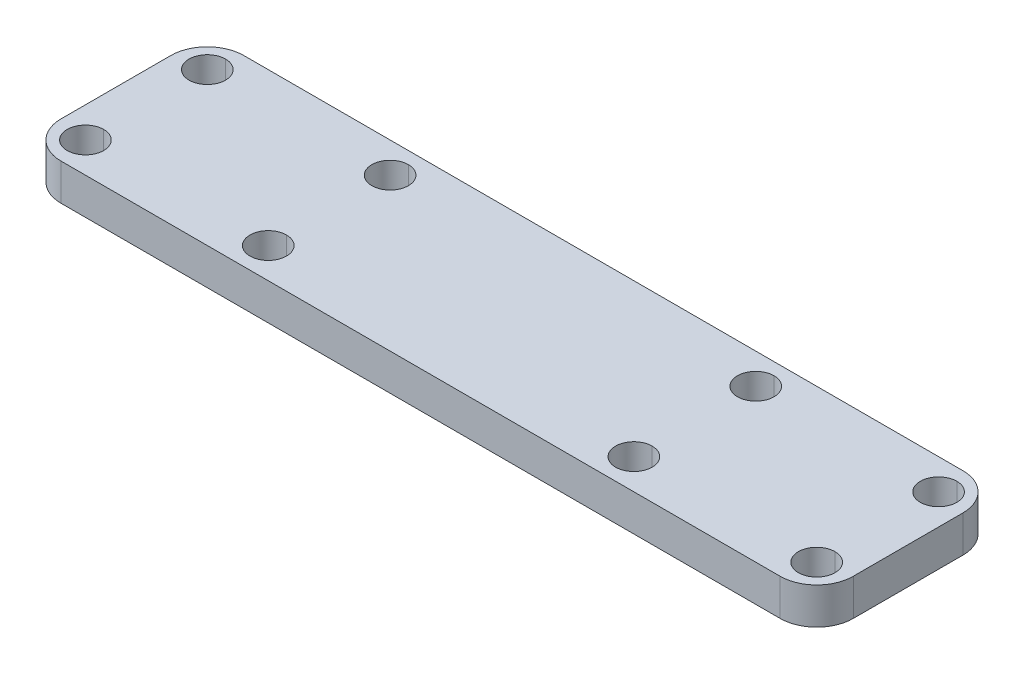
ISO-10303-21;
HEADER;
FILE_DESCRIPTION(('STEP AP214'),'2;1');
FILE_NAME('part.step','',(''),(''),'','','');
FILE_SCHEMA(('AUTOMOTIVE_DESIGN { 1 0 10303 214 1 1 1 1 }'));
ENDSEC;
DATA;
#1=APPLICATION_CONTEXT('core data for automotive mechanical design processes');
#2=APPLICATION_PROTOCOL_DEFINITION('international standard','automotive_design',2000,#1);
#3=PRODUCT_CONTEXT('',#1,'mechanical');
#4=PRODUCT('Part','Part','',(#3));
#5=PRODUCT_RELATED_PRODUCT_CATEGORY('part','',(#4));
#6=PRODUCT_DEFINITION_FORMATION('','',#4);
#7=PRODUCT_DEFINITION_CONTEXT('part definition',#1,'design');
#8=PRODUCT_DEFINITION('design','',#6,#7);
#9=PRODUCT_DEFINITION_SHAPE('','',#8);
#10=(LENGTH_UNIT() NAMED_UNIT(*) SI_UNIT(.MILLI.,.METRE.));
#11=(NAMED_UNIT(*) PLANE_ANGLE_UNIT() SI_UNIT($,.RADIAN.));
#12=(NAMED_UNIT(*) SI_UNIT($,.STERADIAN.) SOLID_ANGLE_UNIT());
#13=UNCERTAINTY_MEASURE_WITH_UNIT(LENGTH_MEASURE(1.E-05),#10,'distance_accuracy_value','');
#14=(GEOMETRIC_REPRESENTATION_CONTEXT(3) GLOBAL_UNCERTAINTY_ASSIGNED_CONTEXT((#13)) GLOBAL_UNIT_ASSIGNED_CONTEXT((#10,
#11,#12)) REPRESENTATION_CONTEXT('',''));
#15=CARTESIAN_POINT('',(0.,0.,0.));
#16=DIRECTION('',(0.,0.,1.));
#17=DIRECTION('',(1.,0.,0.));
#18=AXIS2_PLACEMENT_3D('',#15,#16,#17);
#19=CARTESIAN_POINT('',(-30.,-7.,-5.));
#20=DIRECTION('',(0.,1.,0.));
#21=DIRECTION('',(0.,0.,1.));
#22=AXIS2_PLACEMENT_3D('',#19,#20,#21);
#23=CYLINDRICAL_SURFACE('',#22,1.5);
#24=DIRECTION('',(0.,1.,0.));
#25=VECTOR('',#24,1.);
#26=CARTESIAN_POINT('',(-30.,-7.,-6.5));
#27=LINE('',#26,#25);
#28=CARTESIAN_POINT('',(-30.,0.,-6.5));
#29=VERTEX_POINT('',#28);
#30=CARTESIAN_POINT('',(-30.,3.,-6.5));
#31=VERTEX_POINT('',#30);
#32=EDGE_CURVE('E578',#29,#31,#27,.T.);
#33=ORIENTED_EDGE('',*,*,#32,.F.);
#34=CARTESIAN_POINT('',(-30.,0.,-5.));
#35=DIRECTION('',(0.,1.,0.));
#36=DIRECTION('',(0.,0.,1.));
#37=AXIS2_PLACEMENT_3D('',#34,#35,#36);
#38=CIRCLE('',#37,1.5);
#39=CARTESIAN_POINT('',(-30.,0.,-3.5));
#40=VERTEX_POINT('',#39);
#41=EDGE_CURVE('E428',#40,#29,#38,.T.);
#42=ORIENTED_EDGE('',*,*,#41,.F.);
#43=DIRECTION('',(0.,1.,0.));
#44=VECTOR('',#43,1.);
#45=CARTESIAN_POINT('',(-30.,-7.,-3.5));
#46=LINE('',#45,#44);
#47=CARTESIAN_POINT('',(-30.,3.,-3.5));
#48=VERTEX_POINT('',#47);
#49=EDGE_CURVE('E263',#40,#48,#46,.T.);
#50=ORIENTED_EDGE('',*,*,#49,.T.);
#51=CARTESIAN_POINT('',(-30.,3.,-5.));
#52=DIRECTION('',(0.,1.,0.));
#53=DIRECTION('',(0.,0.,1.));
#54=AXIS2_PLACEMENT_3D('',#51,#52,#53);
#55=CIRCLE('',#54,1.5);
#56=EDGE_CURVE('E246',#48,#31,#55,.T.);
#57=ORIENTED_EDGE('',*,*,#56,.T.);
#58=EDGE_LOOP('',(#33,#42,#50,#57));
#59=FACE_BOUND('',#58,.T.);
#60=ADVANCED_FACE('F16',(#59),#23,.F.);
#61=CARTESIAN_POINT('',(-15.,-7.,-5.));
#62=DIRECTION('',(0.,1.,0.));
#63=DIRECTION('',(0.,0.,1.));
#64=AXIS2_PLACEMENT_3D('',#61,#62,#63);
#65=CYLINDRICAL_SURFACE('',#64,1.5);
#66=DIRECTION('',(0.,1.,0.));
#67=VECTOR('',#66,1.);
#68=CARTESIAN_POINT('',(-15.,-7.,-6.5));
#69=LINE('',#68,#67);
#70=CARTESIAN_POINT('',(-15.,0.,-6.5));
#71=VERTEX_POINT('',#70);
#72=CARTESIAN_POINT('',(-15.,3.,-6.5));
#73=VERTEX_POINT('',#72);
#74=EDGE_CURVE('E238',#71,#73,#69,.T.);
#75=ORIENTED_EDGE('',*,*,#74,.F.);
#76=CARTESIAN_POINT('',(-15.,0.,-5.));
#77=DIRECTION('',(0.,1.,0.));
#78=DIRECTION('',(0.,0.,1.));
#79=AXIS2_PLACEMENT_3D('',#76,#77,#78);
#80=CIRCLE('',#79,1.5);
#81=CARTESIAN_POINT('',(-15.,0.,-3.5));
#82=VERTEX_POINT('',#81);
#83=EDGE_CURVE('E396',#82,#71,#80,.T.);
#84=ORIENTED_EDGE('',*,*,#83,.F.);
#85=DIRECTION('',(0.,1.,0.));
#86=VECTOR('',#85,1.);
#87=CARTESIAN_POINT('',(-15.,-7.,-3.5));
#88=LINE('',#87,#86);
#89=CARTESIAN_POINT('',(-15.,3.,-3.5));
#90=VERTEX_POINT('',#89);
#91=EDGE_CURVE('E241',#82,#90,#88,.T.);
#92=ORIENTED_EDGE('',*,*,#91,.T.);
#93=CARTESIAN_POINT('',(-15.,3.,-5.));
#94=DIRECTION('',(0.,1.,0.));
#95=DIRECTION('',(0.,0.,1.));
#96=AXIS2_PLACEMENT_3D('',#93,#94,#95);
#97=CIRCLE('',#96,1.5);
#98=EDGE_CURVE('E234',#90,#73,#97,.T.);
#99=ORIENTED_EDGE('',*,*,#98,.T.);
#100=EDGE_LOOP('',(#75,#84,#92,#99));
#101=FACE_BOUND('',#100,.T.);
#102=ADVANCED_FACE('F236',(#101),#65,.F.);
#103=CARTESIAN_POINT('',(15.,-7.,-5.));
#104=DIRECTION('',(0.,1.,0.));
#105=DIRECTION('',(0.,0.,1.));
#106=AXIS2_PLACEMENT_3D('',#103,#104,#105);
#107=CYLINDRICAL_SURFACE('',#106,1.5);
#108=DIRECTION('',(0.,1.,0.));
#109=VECTOR('',#108,1.);
#110=CARTESIAN_POINT('',(15.,-7.,-6.5));
#111=LINE('',#110,#109);
#112=CARTESIAN_POINT('',(15.,0.,-6.5));
#113=VERTEX_POINT('',#112);
#114=CARTESIAN_POINT('',(15.,3.,-6.5));
#115=VERTEX_POINT('',#114);
#116=EDGE_CURVE('E285',#113,#115,#111,.T.);
#117=ORIENTED_EDGE('',*,*,#116,.F.);
#118=CARTESIAN_POINT('',(15.,0.,-5.));
#119=DIRECTION('',(0.,1.,0.));
#120=DIRECTION('',(0.,0.,1.));
#121=AXIS2_PLACEMENT_3D('',#118,#119,#120);
#122=CIRCLE('',#121,1.5);
#123=CARTESIAN_POINT('',(15.,0.,-3.5));
#124=VERTEX_POINT('',#123);
#125=EDGE_CURVE('E392',#124,#113,#122,.T.);
#126=ORIENTED_EDGE('',*,*,#125,.F.);
#127=DIRECTION('',(0.,1.,0.));
#128=VECTOR('',#127,1.);
#129=CARTESIAN_POINT('',(15.,-7.,-3.5));
#130=LINE('',#129,#128);
#131=CARTESIAN_POINT('',(15.,3.,-3.5));
#132=VERTEX_POINT('',#131);
#133=EDGE_CURVE('E295',#124,#132,#130,.T.);
#134=ORIENTED_EDGE('',*,*,#133,.T.);
#135=CARTESIAN_POINT('',(15.,3.,-5.));
#136=DIRECTION('',(0.,1.,0.));
#137=DIRECTION('',(0.,0.,1.));
#138=AXIS2_PLACEMENT_3D('',#135,#136,#137);
#139=CIRCLE('',#138,1.5);
#140=EDGE_CURVE('E245',#132,#115,#139,.T.);
#141=ORIENTED_EDGE('',*,*,#140,.T.);
#142=EDGE_LOOP('',(#117,#126,#134,#141));
#143=FACE_BOUND('',#142,.T.);
#144=ADVANCED_FACE('F507',(#143),#107,.F.);
#145=CARTESIAN_POINT('',(30.,-7.,-5.));
#146=DIRECTION('',(0.,1.,0.));
#147=DIRECTION('',(0.,0.,1.));
#148=AXIS2_PLACEMENT_3D('',#145,#146,#147);
#149=CYLINDRICAL_SURFACE('',#148,1.5);
#150=DIRECTION('',(0.,1.,0.));
#151=VECTOR('',#150,1.);
#152=CARTESIAN_POINT('',(30.,-7.,-6.5));
#153=LINE('',#152,#151);
#154=CARTESIAN_POINT('',(30.,0.,-6.5));
#155=VERTEX_POINT('',#154);
#156=CARTESIAN_POINT('',(30.,3.,-6.5));
#157=VERTEX_POINT('',#156);
#158=EDGE_CURVE('E300',#155,#157,#153,.T.);
#159=ORIENTED_EDGE('',*,*,#158,.F.);
#160=CARTESIAN_POINT('',(30.,0.,-5.));
#161=DIRECTION('',(0.,1.,0.));
#162=DIRECTION('',(0.,0.,1.));
#163=AXIS2_PLACEMENT_3D('',#160,#161,#162);
#164=CIRCLE('',#163,1.5);
#165=CARTESIAN_POINT('',(30.,0.,-3.5));
#166=VERTEX_POINT('',#165);
#167=EDGE_CURVE('E395',#166,#155,#164,.T.);
#168=ORIENTED_EDGE('',*,*,#167,.F.);
#169=DIRECTION('',(0.,1.,0.));
#170=VECTOR('',#169,1.);
#171=CARTESIAN_POINT('',(30.,-7.,-3.5));
#172=LINE('',#171,#170);
#173=CARTESIAN_POINT('',(30.,3.,-3.5));
#174=VERTEX_POINT('',#173);
#175=EDGE_CURVE('E269',#166,#174,#172,.T.);
#176=ORIENTED_EDGE('',*,*,#175,.T.);
#177=CARTESIAN_POINT('',(30.,3.,-5.));
#178=DIRECTION('',(0.,1.,0.));
#179=DIRECTION('',(0.,0.,1.));
#180=AXIS2_PLACEMENT_3D('',#177,#178,#179);
#181=CIRCLE('',#180,1.5);
#182=EDGE_CURVE('E448',#174,#157,#181,.T.);
#183=ORIENTED_EDGE('',*,*,#182,.T.);
#184=EDGE_LOOP('',(#159,#168,#176,#183));
#185=FACE_BOUND('',#184,.T.);
#186=ADVANCED_FACE('F607',(#185),#149,.F.);
#187=CARTESIAN_POINT('',(-29.5,3.,-4.5));
#188=DIRECTION('',(0.,-1.,0.));
#189=DIRECTION('',(0.,0.,-1.));
#190=AXIS2_PLACEMENT_3D('',#187,#188,#189);
#191=CYLINDRICAL_SURFACE('',#190,3.);
#192=CARTESIAN_POINT('',(-29.5,3.,-4.5));
#193=DIRECTION('',(0.,1.,0.));
#194=DIRECTION('',(0.,0.,1.));
#195=AXIS2_PLACEMENT_3D('',#192,#193,#194);
#196=CIRCLE('',#195,3.);
#197=CARTESIAN_POINT('',(-29.5,3.,-7.5));
#198=VERTEX_POINT('',#197);
#199=CARTESIAN_POINT('',(-32.5,3.,-4.5));
#200=VERTEX_POINT('',#199);
#201=EDGE_CURVE('E441',#198,#200,#196,.T.);
#202=ORIENTED_EDGE('',*,*,#201,.F.);
#203=DIRECTION('',(0.,1.,0.));
#204=VECTOR('',#203,1.);
#205=CARTESIAN_POINT('',(-29.5,3.,-7.5));
#206=LINE('',#205,#204);
#207=CARTESIAN_POINT('',(-29.5,0.,-7.5));
#208=VERTEX_POINT('',#207);
#209=EDGE_CURVE('E342',#208,#198,#206,.T.);
#210=ORIENTED_EDGE('',*,*,#209,.F.);
#211=CARTESIAN_POINT('',(-29.5,0.,-4.5));
#212=DIRECTION('',(0.,-1.,0.));
#213=DIRECTION('',(0.,0.,1.));
#214=AXIS2_PLACEMENT_3D('',#211,#212,#213);
#215=CIRCLE('',#214,3.);
#216=CARTESIAN_POINT('',(-32.5,0.,-4.5));
#217=VERTEX_POINT('',#216);
#218=EDGE_CURVE('E462',#217,#208,#215,.T.);
#219=ORIENTED_EDGE('',*,*,#218,.F.);
#220=DIRECTION('',(0.,-1.,0.));
#221=VECTOR('',#220,1.);
#222=CARTESIAN_POINT('',(-32.5,3.,-4.5));
#223=LINE('',#222,#221);
#224=EDGE_CURVE('E266',#200,#217,#223,.T.);
#225=ORIENTED_EDGE('',*,*,#224,.F.);
#226=EDGE_LOOP('',(#202,#210,#219,#225));
#227=FACE_BOUND('',#226,.T.);
#228=ADVANCED_FACE('F605',(#227),#191,.T.);
#229=CARTESIAN_POINT('',(-29.5,3.,4.5));
#230=DIRECTION('',(0.,-1.,0.));
#231=DIRECTION('',(0.,0.,-1.));
#232=AXIS2_PLACEMENT_3D('',#229,#230,#231);
#233=CYLINDRICAL_SURFACE('',#232,3.);
#234=CARTESIAN_POINT('',(-29.5,3.,4.5));
#235=DIRECTION('',(0.,1.,0.));
#236=DIRECTION('',(0.,0.,1.));
#237=AXIS2_PLACEMENT_3D('',#234,#235,#236);
#238=CIRCLE('',#237,3.);
#239=CARTESIAN_POINT('',(-32.5,3.,4.5));
#240=VERTEX_POINT('',#239);
#241=CARTESIAN_POINT('',(-29.5,3.,7.5));
#242=VERTEX_POINT('',#241);
#243=EDGE_CURVE('E37',#240,#242,#238,.T.);
#244=ORIENTED_EDGE('',*,*,#243,.F.);
#245=DIRECTION('',(0.,1.,0.));
#246=VECTOR('',#245,1.);
#247=CARTESIAN_POINT('',(-32.5,3.,4.5));
#248=LINE('',#247,#246);
#249=CARTESIAN_POINT('',(-32.5,0.,4.5));
#250=VERTEX_POINT('',#249);
#251=EDGE_CURVE('E341',#250,#240,#248,.T.);
#252=ORIENTED_EDGE('',*,*,#251,.F.);
#253=CARTESIAN_POINT('',(-29.5,0.,4.5));
#254=DIRECTION('',(0.,-1.,0.));
#255=DIRECTION('',(0.,0.,1.));
#256=AXIS2_PLACEMENT_3D('',#253,#254,#255);
#257=CIRCLE('',#256,3.);
#258=CARTESIAN_POINT('',(-29.5,0.,7.5));
#259=VERTEX_POINT('',#258);
#260=EDGE_CURVE('E459',#259,#250,#257,.T.);
#261=ORIENTED_EDGE('',*,*,#260,.F.);
#262=DIRECTION('',(0.,-1.,0.));
#263=VECTOR('',#262,1.);
#264=CARTESIAN_POINT('',(-29.5,3.,7.5));
#265=LINE('',#264,#263);
#266=EDGE_CURVE('E434',#242,#259,#265,.T.);
#267=ORIENTED_EDGE('',*,*,#266,.F.);
#268=EDGE_LOOP('',(#244,#252,#261,#267));
#269=FACE_BOUND('',#268,.T.);
#270=ADVANCED_FACE('F543',(#269),#233,.T.);
#271=CARTESIAN_POINT('',(29.5,3.,4.5));
#272=DIRECTION('',(0.,-1.,0.));
#273=DIRECTION('',(0.,0.,-1.));
#274=AXIS2_PLACEMENT_3D('',#271,#272,#273);
#275=CYLINDRICAL_SURFACE('',#274,3.);
#276=CARTESIAN_POINT('',(29.5,3.,4.5));
#277=DIRECTION('',(0.,1.,0.));
#278=DIRECTION('',(0.,0.,1.));
#279=AXIS2_PLACEMENT_3D('',#276,#277,#278);
#280=CIRCLE('',#279,3.);
#281=CARTESIAN_POINT('',(29.5,3.,7.5));
#282=VERTEX_POINT('',#281);
#283=CARTESIAN_POINT('',(32.5,3.,4.5));
#284=VERTEX_POINT('',#283);
#285=EDGE_CURVE('E48',#282,#284,#280,.T.);
#286=ORIENTED_EDGE('',*,*,#285,.F.);
#287=DIRECTION('',(0.,1.,0.));
#288=VECTOR('',#287,1.);
#289=CARTESIAN_POINT('',(29.5,3.,7.5));
#290=LINE('',#289,#288);
#291=CARTESIAN_POINT('',(29.5,0.,7.5));
#292=VERTEX_POINT('',#291);
#293=EDGE_CURVE('E418',#292,#282,#290,.T.);
#294=ORIENTED_EDGE('',*,*,#293,.F.);
#295=CARTESIAN_POINT('',(29.5,0.,4.5));
#296=DIRECTION('',(0.,-1.,0.));
#297=DIRECTION('',(0.,0.,1.));
#298=AXIS2_PLACEMENT_3D('',#295,#296,#297);
#299=CIRCLE('',#298,3.);
#300=CARTESIAN_POINT('',(32.5,0.,4.5));
#301=VERTEX_POINT('',#300);
#302=EDGE_CURVE('E463',#301,#292,#299,.T.);
#303=ORIENTED_EDGE('',*,*,#302,.F.);
#304=DIRECTION('',(0.,-1.,0.));
#305=VECTOR('',#304,1.);
#306=CARTESIAN_POINT('',(32.5,3.,4.5));
#307=LINE('',#306,#305);
#308=EDGE_CURVE('E307',#284,#301,#307,.T.);
#309=ORIENTED_EDGE('',*,*,#308,.F.);
#310=EDGE_LOOP('',(#286,#294,#303,#309));
#311=FACE_BOUND('',#310,.T.);
#312=ADVANCED_FACE('F539',(#311),#275,.T.);
#313=CARTESIAN_POINT('',(29.5,3.,-4.5));
#314=DIRECTION('',(0.,-1.,0.));
#315=DIRECTION('',(0.,0.,-1.));
#316=AXIS2_PLACEMENT_3D('',#313,#314,#315);
#317=CYLINDRICAL_SURFACE('',#316,3.);
#318=CARTESIAN_POINT('',(29.5,3.,-4.5));
#319=DIRECTION('',(0.,1.,0.));
#320=DIRECTION('',(0.,0.,1.));
#321=AXIS2_PLACEMENT_3D('',#318,#319,#320);
#322=CIRCLE('',#321,3.);
#323=CARTESIAN_POINT('',(32.5,3.,-4.5));
#324=VERTEX_POINT('',#323);
#325=CARTESIAN_POINT('',(29.5,3.,-7.5));
#326=VERTEX_POINT('',#325);
#327=EDGE_CURVE('E438',#324,#326,#322,.T.);
#328=ORIENTED_EDGE('',*,*,#327,.F.);
#329=DIRECTION('',(0.,1.,0.));
#330=VECTOR('',#329,1.);
#331=CARTESIAN_POINT('',(32.5,3.,-4.5));
#332=LINE('',#331,#330);
#333=CARTESIAN_POINT('',(32.5,0.,-4.5));
#334=VERTEX_POINT('',#333);
#335=EDGE_CURVE('E388',#334,#324,#332,.T.);
#336=ORIENTED_EDGE('',*,*,#335,.F.);
#337=CARTESIAN_POINT('',(29.5,0.,-4.5));
#338=DIRECTION('',(0.,-1.,0.));
#339=DIRECTION('',(0.,0.,1.));
#340=AXIS2_PLACEMENT_3D('',#337,#338,#339);
#341=CIRCLE('',#340,3.);
#342=CARTESIAN_POINT('',(29.5,0.,-7.5));
#343=VERTEX_POINT('',#342);
#344=EDGE_CURVE('E466',#343,#334,#341,.T.);
#345=ORIENTED_EDGE('',*,*,#344,.F.);
#346=DIRECTION('',(0.,-1.,0.));
#347=VECTOR('',#346,1.);
#348=CARTESIAN_POINT('',(29.5,3.,-7.5));
#349=LINE('',#348,#347);
#350=EDGE_CURVE('E403',#326,#343,#349,.T.);
#351=ORIENTED_EDGE('',*,*,#350,.F.);
#352=EDGE_LOOP('',(#328,#336,#345,#351));
#353=FACE_BOUND('',#352,.T.);
#354=ADVANCED_FACE('F532',(#353),#317,.T.);
#355=CARTESIAN_POINT('',(-30.,-7.,5.));
#356=DIRECTION('',(0.,1.,0.));
#357=DIRECTION('',(0.,0.,1.));
#358=AXIS2_PLACEMENT_3D('',#355,#356,#357);
#359=CYLINDRICAL_SURFACE('',#358,1.5);
#360=DIRECTION('',(0.,1.,0.));
#361=VECTOR('',#360,1.);
#362=CARTESIAN_POINT('',(-30.,-7.,3.5));
#363=LINE('',#362,#361);
#364=CARTESIAN_POINT('',(-30.,0.,3.5));
#365=VERTEX_POINT('',#364);
#366=CARTESIAN_POINT('',(-30.,3.,3.5));
#367=VERTEX_POINT('',#366);
#368=EDGE_CURVE('E316',#365,#367,#363,.T.);
#369=ORIENTED_EDGE('',*,*,#368,.F.);
#370=CARTESIAN_POINT('',(-30.,0.,5.));
#371=DIRECTION('',(0.,1.,0.));
#372=DIRECTION('',(0.,0.,1.));
#373=AXIS2_PLACEMENT_3D('',#370,#371,#372);
#374=CIRCLE('',#373,1.5);
#375=CARTESIAN_POINT('',(-30.,0.,6.5));
#376=VERTEX_POINT('',#375);
#377=EDGE_CURVE('E278',#376,#365,#374,.T.);
#378=ORIENTED_EDGE('',*,*,#377,.F.);
#379=DIRECTION('',(0.,1.,0.));
#380=VECTOR('',#379,1.);
#381=CARTESIAN_POINT('',(-30.,-7.,6.5));
#382=LINE('',#381,#380);
#383=CARTESIAN_POINT('',(-30.,3.,6.5));
#384=VERTEX_POINT('',#383);
#385=EDGE_CURVE('E321',#376,#384,#382,.T.);
#386=ORIENTED_EDGE('',*,*,#385,.T.);
#387=CARTESIAN_POINT('',(-30.,3.,5.));
#388=DIRECTION('',(0.,1.,0.));
#389=DIRECTION('',(0.,0.,1.));
#390=AXIS2_PLACEMENT_3D('',#387,#388,#389);
#391=CIRCLE('',#390,1.5);
#392=EDGE_CURVE('E451',#384,#367,#391,.T.);
#393=ORIENTED_EDGE('',*,*,#392,.T.);
#394=EDGE_LOOP('',(#369,#378,#386,#393));
#395=FACE_BOUND('',#394,.T.);
#396=ADVANCED_FACE('F669',(#395),#359,.F.);
#397=CARTESIAN_POINT('',(-15.,-7.,5.));
#398=DIRECTION('',(0.,1.,0.));
#399=DIRECTION('',(0.,0.,1.));
#400=AXIS2_PLACEMENT_3D('',#397,#398,#399);
#401=CYLINDRICAL_SURFACE('',#400,1.5);
#402=DIRECTION('',(0.,1.,0.));
#403=VECTOR('',#402,1.);
#404=CARTESIAN_POINT('',(-15.,-7.,3.5));
#405=LINE('',#404,#403);
#406=CARTESIAN_POINT('',(-15.,0.,3.5));
#407=VERTEX_POINT('',#406);
#408=CARTESIAN_POINT('',(-15.,3.,3.5));
#409=VERTEX_POINT('',#408);
#410=EDGE_CURVE('E332',#407,#409,#405,.T.);
#411=ORIENTED_EDGE('',*,*,#410,.F.);
#412=CARTESIAN_POINT('',(-15.,0.,5.));
#413=DIRECTION('',(0.,1.,0.));
#414=DIRECTION('',(0.,0.,1.));
#415=AXIS2_PLACEMENT_3D('',#412,#413,#414);
#416=CIRCLE('',#415,1.5);
#417=CARTESIAN_POINT('',(-15.,0.,6.5));
#418=VERTEX_POINT('',#417);
#419=EDGE_CURVE('E275',#418,#407,#416,.T.);
#420=ORIENTED_EDGE('',*,*,#419,.F.);
#421=DIRECTION('',(0.,1.,0.));
#422=VECTOR('',#421,1.);
#423=CARTESIAN_POINT('',(-15.,-7.,6.5));
#424=LINE('',#423,#422);
#425=CARTESIAN_POINT('',(-15.,3.,6.5));
#426=VERTEX_POINT('',#425);
#427=EDGE_CURVE('E343',#418,#426,#424,.T.);
#428=ORIENTED_EDGE('',*,*,#427,.T.);
#429=CARTESIAN_POINT('',(-15.,3.,5.));
#430=DIRECTION('',(0.,1.,0.));
#431=DIRECTION('',(0.,0.,1.));
#432=AXIS2_PLACEMENT_3D('',#429,#430,#431);
#433=CIRCLE('',#432,1.5);
#434=EDGE_CURVE('E452',#426,#409,#433,.T.);
#435=ORIENTED_EDGE('',*,*,#434,.T.);
#436=EDGE_LOOP('',(#411,#420,#428,#435));
#437=FACE_BOUND('',#436,.T.);
#438=ADVANCED_FACE('F679',(#437),#401,.F.);
#439=CARTESIAN_POINT('',(15.,-7.,5.));
#440=DIRECTION('',(0.,1.,0.));
#441=DIRECTION('',(0.,0.,1.));
#442=AXIS2_PLACEMENT_3D('',#439,#440,#441);
#443=CYLINDRICAL_SURFACE('',#442,1.5);
#444=DIRECTION('',(0.,1.,0.));
#445=VECTOR('',#444,1.);
#446=CARTESIAN_POINT('',(15.,-7.,3.5));
#447=LINE('',#446,#445);
#448=CARTESIAN_POINT('',(15.,0.,3.5));
#449=VERTEX_POINT('',#448);
#450=CARTESIAN_POINT('',(15.,3.,3.5));
#451=VERTEX_POINT('',#450);
#452=EDGE_CURVE('E356',#449,#451,#447,.T.);
#453=ORIENTED_EDGE('',*,*,#452,.F.);
#454=CARTESIAN_POINT('',(15.,0.,5.));
#455=DIRECTION('',(0.,1.,0.));
#456=DIRECTION('',(0.,0.,1.));
#457=AXIS2_PLACEMENT_3D('',#454,#455,#456);
#458=CIRCLE('',#457,1.5);
#459=CARTESIAN_POINT('',(15.,0.,6.5));
#460=VERTEX_POINT('',#459);
#461=EDGE_CURVE('E24',#460,#449,#458,.T.);
#462=ORIENTED_EDGE('',*,*,#461,.F.);
#463=DIRECTION('',(0.,1.,0.));
#464=VECTOR('',#463,1.);
#465=CARTESIAN_POINT('',(15.,-7.,6.5));
#466=LINE('',#465,#464);
#467=CARTESIAN_POINT('',(15.,3.,6.5));
#468=VERTEX_POINT('',#467);
#469=EDGE_CURVE('E364',#460,#468,#466,.T.);
#470=ORIENTED_EDGE('',*,*,#469,.T.);
#471=CARTESIAN_POINT('',(15.,3.,5.));
#472=DIRECTION('',(0.,1.,0.));
#473=DIRECTION('',(0.,0.,1.));
#474=AXIS2_PLACEMENT_3D('',#471,#472,#473);
#475=CIRCLE('',#474,1.5);
#476=EDGE_CURVE('E455',#468,#451,#475,.T.);
#477=ORIENTED_EDGE('',*,*,#476,.T.);
#478=EDGE_LOOP('',(#453,#462,#470,#477));
#479=FACE_BOUND('',#478,.T.);
#480=ADVANCED_FACE('F486',(#479),#443,.F.);
#481=CARTESIAN_POINT('',(30.,-7.,5.));
#482=DIRECTION('',(0.,1.,0.));
#483=DIRECTION('',(0.,0.,1.));
#484=AXIS2_PLACEMENT_3D('',#481,#482,#483);
#485=CYLINDRICAL_SURFACE('',#484,1.5);
#486=DIRECTION('',(0.,1.,0.));
#487=VECTOR('',#486,1.);
#488=CARTESIAN_POINT('',(30.,-7.,3.5));
#489=LINE('',#488,#487);
#490=CARTESIAN_POINT('',(30.,0.,3.5));
#491=VERTEX_POINT('',#490);
#492=CARTESIAN_POINT('',(30.,3.,3.5));
#493=VERTEX_POINT('',#492);
#494=EDGE_CURVE('E372',#491,#493,#489,.T.);
#495=ORIENTED_EDGE('',*,*,#494,.F.);
#496=CARTESIAN_POINT('',(30.,0.,5.));
#497=DIRECTION('',(0.,1.,0.));
#498=DIRECTION('',(0.,0.,1.));
#499=AXIS2_PLACEMENT_3D('',#496,#497,#498);
#500=CIRCLE('',#499,1.5);
#501=CARTESIAN_POINT('',(30.,0.,6.5));
#502=VERTEX_POINT('',#501);
#503=EDGE_CURVE('E10',#502,#491,#500,.T.);
#504=ORIENTED_EDGE('',*,*,#503,.F.);
#505=DIRECTION('',(0.,1.,0.));
#506=VECTOR('',#505,1.);
#507=CARTESIAN_POINT('',(30.,-7.,6.5));
#508=LINE('',#507,#506);
#509=CARTESIAN_POINT('',(30.,3.,6.5));
#510=VERTEX_POINT('',#509);
#511=EDGE_CURVE('E380',#502,#510,#508,.T.);
#512=ORIENTED_EDGE('',*,*,#511,.T.);
#513=CARTESIAN_POINT('',(30.,3.,5.));
#514=DIRECTION('',(0.,1.,0.));
#515=DIRECTION('',(0.,0.,1.));
#516=AXIS2_PLACEMENT_3D('',#513,#514,#515);
#517=CIRCLE('',#516,1.5);
#518=EDGE_CURVE('E458',#510,#493,#517,.T.);
#519=ORIENTED_EDGE('',*,*,#518,.T.);
#520=EDGE_LOOP('',(#495,#504,#512,#519));
#521=FACE_BOUND('',#520,.T.);
#522=ADVANCED_FACE('F515',(#521),#485,.F.);
#523=CARTESIAN_POINT('',(0.,0.,0.));
#524=DIRECTION('',(0.,1.,0.));
#525=DIRECTION('',(1.,0.,0.));
#526=AXIS2_PLACEMENT_3D('',#523,#524,#525);
#527=PLANE('',#526);
#528=ORIENTED_EDGE('',*,*,#503,.T.);
#529=CARTESIAN_POINT('',(30.,0.,5.));
#530=DIRECTION('',(0.,1.,0.));
#531=DIRECTION('',(0.,0.,1.));
#532=AXIS2_PLACEMENT_3D('',#529,#530,#531);
#533=CIRCLE('',#532,1.5);
#534=EDGE_CURVE('E368',#491,#502,#533,.T.);
#535=ORIENTED_EDGE('',*,*,#534,.T.);
#536=EDGE_LOOP('',(#528,#535));
#537=FACE_BOUND('',#536,.T.);
#538=ORIENTED_EDGE('',*,*,#461,.T.);
#539=CARTESIAN_POINT('',(15.,0.,5.));
#540=DIRECTION('',(0.,1.,0.));
#541=DIRECTION('',(0.,0.,1.));
#542=AXIS2_PLACEMENT_3D('',#539,#540,#541);
#543=CIRCLE('',#542,1.5);
#544=EDGE_CURVE('E347',#449,#460,#543,.T.);
#545=ORIENTED_EDGE('',*,*,#544,.T.);
#546=EDGE_LOOP('',(#538,#545));
#547=FACE_BOUND('',#546,.T.);
#548=ORIENTED_EDGE('',*,*,#419,.T.);
#549=CARTESIAN_POINT('',(-15.,0.,5.));
#550=DIRECTION('',(0.,1.,0.));
#551=DIRECTION('',(0.,0.,1.));
#552=AXIS2_PLACEMENT_3D('',#549,#550,#551);
#553=CIRCLE('',#552,1.5);
#554=EDGE_CURVE('E325',#407,#418,#553,.T.);
#555=ORIENTED_EDGE('',*,*,#554,.T.);
#556=EDGE_LOOP('',(#548,#555));
#557=FACE_BOUND('',#556,.T.);
#558=ORIENTED_EDGE('',*,*,#377,.T.);
#559=CARTESIAN_POINT('',(-30.,0.,5.));
#560=DIRECTION('',(0.,1.,0.));
#561=DIRECTION('',(0.,0.,1.));
#562=AXIS2_PLACEMENT_3D('',#559,#560,#561);
#563=CIRCLE('',#562,1.5);
#564=EDGE_CURVE('E273',#365,#376,#563,.T.);
#565=ORIENTED_EDGE('',*,*,#564,.T.);
#566=EDGE_LOOP('',(#558,#565));
#567=FACE_BOUND('',#566,.T.);
#568=ORIENTED_EDGE('',*,*,#167,.T.);
#569=CARTESIAN_POINT('',(30.,0.,-5.));
#570=DIRECTION('',(0.,1.,0.));
#571=DIRECTION('',(0.,0.,1.));
#572=AXIS2_PLACEMENT_3D('',#569,#570,#571);
#573=CIRCLE('',#572,1.5);
#574=EDGE_CURVE('E296',#155,#166,#573,.T.);
#575=ORIENTED_EDGE('',*,*,#574,.T.);
#576=EDGE_LOOP('',(#568,#575));
#577=FACE_BOUND('',#576,.T.);
#578=ORIENTED_EDGE('',*,*,#125,.T.);
#579=CARTESIAN_POINT('',(15.,0.,-5.));
#580=DIRECTION('',(0.,1.,0.));
#581=DIRECTION('',(0.,0.,1.));
#582=AXIS2_PLACEMENT_3D('',#579,#580,#581);
#583=CIRCLE('',#582,1.5);
#584=EDGE_CURVE('E281',#113,#124,#583,.T.);
#585=ORIENTED_EDGE('',*,*,#584,.T.);
#586=EDGE_LOOP('',(#578,#585));
#587=FACE_BOUND('',#586,.T.);
#588=ORIENTED_EDGE('',*,*,#83,.T.);
#589=CARTESIAN_POINT('',(-15.,0.,-5.));
#590=DIRECTION('',(0.,1.,0.));
#591=DIRECTION('',(0.,0.,1.));
#592=AXIS2_PLACEMENT_3D('',#589,#590,#591);
#593=CIRCLE('',#592,1.5);
#594=EDGE_CURVE('E256',#71,#82,#593,.T.);
#595=ORIENTED_EDGE('',*,*,#594,.T.);
#596=EDGE_LOOP('',(#588,#595));
#597=FACE_BOUND('',#596,.T.);
#598=ORIENTED_EDGE('',*,*,#41,.T.);
#599=CARTESIAN_POINT('',(-30.,0.,-5.));
#600=DIRECTION('',(0.,1.,0.));
#601=DIRECTION('',(0.,0.,1.));
#602=AXIS2_PLACEMENT_3D('',#599,#600,#601);
#603=CIRCLE('',#602,1.5);
#604=EDGE_CURVE('E590',#29,#40,#603,.T.);
#605=ORIENTED_EDGE('',*,*,#604,.T.);
#606=EDGE_LOOP('',(#598,#605));
#607=FACE_BOUND('',#606,.T.);
#608=DIRECTION('',(-1.,0.,0.));
#609=VECTOR('',#608,1.);
#610=CARTESIAN_POINT('',(-32.5,0.,-7.5));
#611=LINE('',#610,#609);
#612=EDGE_CURVE('E407',#343,#208,#611,.T.);
#613=ORIENTED_EDGE('',*,*,#612,.F.);
#614=ORIENTED_EDGE('',*,*,#344,.T.);
#615=DIRECTION('',(0.,0.,-1.));
#616=VECTOR('',#615,1.);
#617=CARTESIAN_POINT('',(32.5,0.,-7.5));
#618=LINE('',#617,#616);
#619=EDGE_CURVE('E384',#301,#334,#618,.T.);
#620=ORIENTED_EDGE('',*,*,#619,.F.);
#621=ORIENTED_EDGE('',*,*,#302,.T.);
#622=DIRECTION('',(1.,0.,0.));
#623=VECTOR('',#622,1.);
#624=CARTESIAN_POINT('',(-32.5,0.,7.5));
#625=LINE('',#624,#623);
#626=EDGE_CURVE('E423',#259,#292,#625,.T.);
#627=ORIENTED_EDGE('',*,*,#626,.F.);
#628=ORIENTED_EDGE('',*,*,#260,.T.);
#629=DIRECTION('',(0.,0.,1.));
#630=VECTOR('',#629,1.);
#631=CARTESIAN_POINT('',(-32.5,0.,-7.5));
#632=LINE('',#631,#630);
#633=EDGE_CURVE('E337',#217,#250,#632,.T.);
#634=ORIENTED_EDGE('',*,*,#633,.F.);
#635=ORIENTED_EDGE('',*,*,#218,.T.);
#636=EDGE_LOOP('',(#613,#614,#620,#621,#627,#628,#634,#635));
#637=FACE_BOUND('',#636,.T.);
#638=ADVANCED_FACE('F481',(#537,#547,#557,#567,#577,#587,#597,#607,#637),#527,.F.);
#639=CARTESIAN_POINT('',(0.,3.,0.));
#640=DIRECTION('',(0.,1.,0.));
#641=DIRECTION('',(1.,0.,0.));
#642=AXIS2_PLACEMENT_3D('',#639,#640,#641);
#643=PLANE('',#642);
#644=ORIENTED_EDGE('',*,*,#518,.F.);
#645=CARTESIAN_POINT('',(30.,3.,5.));
#646=DIRECTION('',(0.,1.,0.));
#647=DIRECTION('',(0.,0.,1.));
#648=AXIS2_PLACEMENT_3D('',#645,#646,#647);
#649=CIRCLE('',#648,1.5);
#650=EDGE_CURVE('E376',#493,#510,#649,.T.);
#651=ORIENTED_EDGE('',*,*,#650,.F.);
#652=EDGE_LOOP('',(#644,#651));
#653=FACE_BOUND('',#652,.T.);
#654=ORIENTED_EDGE('',*,*,#476,.F.);
#655=CARTESIAN_POINT('',(15.,3.,5.));
#656=DIRECTION('',(0.,1.,0.));
#657=DIRECTION('',(0.,0.,1.));
#658=AXIS2_PLACEMENT_3D('',#655,#656,#657);
#659=CIRCLE('',#658,1.5);
#660=EDGE_CURVE('E360',#451,#468,#659,.T.);
#661=ORIENTED_EDGE('',*,*,#660,.F.);
#662=EDGE_LOOP('',(#654,#661));
#663=FACE_BOUND('',#662,.T.);
#664=ORIENTED_EDGE('',*,*,#434,.F.);
#665=CARTESIAN_POINT('',(-15.,3.,5.));
#666=DIRECTION('',(0.,1.,0.));
#667=DIRECTION('',(0.,0.,1.));
#668=AXIS2_PLACEMENT_3D('',#665,#666,#667);
#669=CIRCLE('',#668,1.5);
#670=EDGE_CURVE('E336',#409,#426,#669,.T.);
#671=ORIENTED_EDGE('',*,*,#670,.F.);
#672=EDGE_LOOP('',(#664,#671));
#673=FACE_BOUND('',#672,.T.);
#674=ORIENTED_EDGE('',*,*,#392,.F.);
#675=CARTESIAN_POINT('',(-30.,3.,5.));
#676=DIRECTION('',(0.,1.,0.));
#677=DIRECTION('',(0.,0.,1.));
#678=AXIS2_PLACEMENT_3D('',#675,#676,#677);
#679=CIRCLE('',#678,1.5);
#680=EDGE_CURVE('E320',#367,#384,#679,.T.);
#681=ORIENTED_EDGE('',*,*,#680,.F.);
#682=EDGE_LOOP('',(#674,#681));
#683=FACE_BOUND('',#682,.T.);
#684=ORIENTED_EDGE('',*,*,#182,.F.);
#685=CARTESIAN_POINT('',(30.,3.,-5.));
#686=DIRECTION('',(0.,1.,0.));
#687=DIRECTION('',(0.,0.,1.));
#688=AXIS2_PLACEMENT_3D('',#685,#686,#687);
#689=CIRCLE('',#688,1.5);
#690=EDGE_CURVE('E274',#157,#174,#689,.T.);
#691=ORIENTED_EDGE('',*,*,#690,.F.);
#692=EDGE_LOOP('',(#684,#691));
#693=FACE_BOUND('',#692,.T.);
#694=ORIENTED_EDGE('',*,*,#140,.F.);
#695=CARTESIAN_POINT('',(15.,3.,-5.));
#696=DIRECTION('',(0.,1.,0.));
#697=DIRECTION('',(0.,0.,1.));
#698=AXIS2_PLACEMENT_3D('',#695,#696,#697);
#699=CIRCLE('',#698,1.5);
#700=EDGE_CURVE('E289',#115,#132,#699,.T.);
#701=ORIENTED_EDGE('',*,*,#700,.F.);
#702=EDGE_LOOP('',(#694,#701));
#703=FACE_BOUND('',#702,.T.);
#704=ORIENTED_EDGE('',*,*,#98,.F.);
#705=CARTESIAN_POINT('',(-15.,3.,-5.));
#706=DIRECTION('',(0.,1.,0.));
#707=DIRECTION('',(0.,0.,1.));
#708=AXIS2_PLACEMENT_3D('',#705,#706,#707);
#709=CIRCLE('',#708,1.5);
#710=EDGE_CURVE('E248',#73,#90,#709,.T.);
#711=ORIENTED_EDGE('',*,*,#710,.F.);
#712=EDGE_LOOP('',(#704,#711));
#713=FACE_BOUND('',#712,.T.);
#714=ORIENTED_EDGE('',*,*,#56,.F.);
#715=CARTESIAN_POINT('',(-30.,3.,-5.));
#716=DIRECTION('',(0.,1.,0.));
#717=DIRECTION('',(0.,0.,1.));
#718=AXIS2_PLACEMENT_3D('',#715,#716,#717);
#719=CIRCLE('',#718,1.5);
#720=EDGE_CURVE('E567',#31,#48,#719,.T.);
#721=ORIENTED_EDGE('',*,*,#720,.F.);
#722=EDGE_LOOP('',(#714,#721));
#723=FACE_BOUND('',#722,.T.);
#724=DIRECTION('',(0.,0.,-1.));
#725=VECTOR('',#724,1.);
#726=CARTESIAN_POINT('',(32.5,3.,-7.5));
#727=LINE('',#726,#725);
#728=EDGE_CURVE('E312',#284,#324,#727,.T.);
#729=ORIENTED_EDGE('',*,*,#728,.T.);
#730=ORIENTED_EDGE('',*,*,#327,.T.);
#731=DIRECTION('',(-1.,0.,0.));
#732=VECTOR('',#731,1.);
#733=CARTESIAN_POINT('',(-32.5,3.,-7.5));
#734=LINE('',#733,#732);
#735=EDGE_CURVE('E311',#326,#198,#734,.T.);
#736=ORIENTED_EDGE('',*,*,#735,.T.);
#737=ORIENTED_EDGE('',*,*,#201,.T.);
#738=DIRECTION('',(0.,0.,1.));
#739=VECTOR('',#738,1.);
#740=CARTESIAN_POINT('',(-32.5,3.,-7.5));
#741=LINE('',#740,#739);
#742=EDGE_CURVE('E417',#200,#240,#741,.T.);
#743=ORIENTED_EDGE('',*,*,#742,.T.);
#744=ORIENTED_EDGE('',*,*,#243,.T.);
#745=DIRECTION('',(1.,0.,0.));
#746=VECTOR('',#745,1.);
#747=CARTESIAN_POINT('',(-32.5,3.,7.5));
#748=LINE('',#747,#746);
#749=EDGE_CURVE('E422',#242,#282,#748,.T.);
#750=ORIENTED_EDGE('',*,*,#749,.T.);
#751=ORIENTED_EDGE('',*,*,#285,.T.);
#752=EDGE_LOOP('',(#729,#730,#736,#737,#743,#744,#750,#751));
#753=FACE_BOUND('',#752,.T.);
#754=ADVANCED_FACE('F249',(#653,#663,#673,#683,#693,#703,#713,#723,#753),#643,.T.);
#755=CARTESIAN_POINT('',(-32.5,3.,7.5));
#756=DIRECTION('',(0.,0.,-1.));
#757=DIRECTION('',(0.,-1.,0.));
#758=AXIS2_PLACEMENT_3D('',#755,#756,#757);
#759=PLANE('',#758);
#760=ORIENTED_EDGE('',*,*,#626,.T.);
#761=ORIENTED_EDGE('',*,*,#293,.T.);
#762=ORIENTED_EDGE('',*,*,#749,.F.);
#763=ORIENTED_EDGE('',*,*,#266,.T.);
#764=EDGE_LOOP('',(#760,#761,#762,#763));
#765=FACE_BOUND('',#764,.T.);
#766=ADVANCED_FACE('F493',(#765),#759,.F.);
#767=CARTESIAN_POINT('',(-32.5,3.,-7.5));
#768=DIRECTION('',(1.,0.,0.));
#769=DIRECTION('',(0.,1.,0.));
#770=AXIS2_PLACEMENT_3D('',#767,#768,#769);
#771=PLANE('',#770);
#772=ORIENTED_EDGE('',*,*,#633,.T.);
#773=ORIENTED_EDGE('',*,*,#251,.T.);
#774=ORIENTED_EDGE('',*,*,#742,.F.);
#775=ORIENTED_EDGE('',*,*,#224,.T.);
#776=EDGE_LOOP('',(#772,#773,#774,#775));
#777=FACE_BOUND('',#776,.T.);
#778=ADVANCED_FACE('F547',(#777),#771,.F.);
#779=CARTESIAN_POINT('',(-32.5,3.,-7.5));
#780=DIRECTION('',(0.,0.,1.));
#781=DIRECTION('',(1.,0.,0.));
#782=AXIS2_PLACEMENT_3D('',#779,#780,#781);
#783=PLANE('',#782);
#784=ORIENTED_EDGE('',*,*,#735,.F.);
#785=ORIENTED_EDGE('',*,*,#350,.T.);
#786=ORIENTED_EDGE('',*,*,#612,.T.);
#787=ORIENTED_EDGE('',*,*,#209,.T.);
#788=EDGE_LOOP('',(#784,#785,#786,#787));
#789=FACE_BOUND('',#788,.T.);
#790=ADVANCED_FACE('F530',(#789),#783,.F.);
#791=CARTESIAN_POINT('',(32.5,3.,-7.5));
#792=DIRECTION('',(-1.,0.,0.));
#793=DIRECTION('',(0.,1.,0.));
#794=AXIS2_PLACEMENT_3D('',#791,#792,#793);
#795=PLANE('',#794);
#796=ORIENTED_EDGE('',*,*,#619,.T.);
#797=ORIENTED_EDGE('',*,*,#335,.T.);
#798=ORIENTED_EDGE('',*,*,#728,.F.);
#799=ORIENTED_EDGE('',*,*,#308,.T.);
#800=EDGE_LOOP('',(#796,#797,#798,#799));
#801=FACE_BOUND('',#800,.T.);
#802=ADVANCED_FACE('F535',(#801),#795,.F.);
#803=CARTESIAN_POINT('',(30.,-7.,5.));
#804=DIRECTION('',(0.,1.,0.));
#805=DIRECTION('',(0.,0.,1.));
#806=AXIS2_PLACEMENT_3D('',#803,#804,#805);
#807=CYLINDRICAL_SURFACE('',#806,1.5);
#808=ORIENTED_EDGE('',*,*,#534,.F.);
#809=ORIENTED_EDGE('',*,*,#494,.T.);
#810=ORIENTED_EDGE('',*,*,#650,.T.);
#811=ORIENTED_EDGE('',*,*,#511,.F.);
#812=EDGE_LOOP('',(#808,#809,#810,#811));
#813=FACE_BOUND('',#812,.T.);
#814=ADVANCED_FACE('F764',(#813),#807,.F.);
#815=CARTESIAN_POINT('',(15.,-7.,5.));
#816=DIRECTION('',(0.,1.,0.));
#817=DIRECTION('',(0.,0.,1.));
#818=AXIS2_PLACEMENT_3D('',#815,#816,#817);
#819=CYLINDRICAL_SURFACE('',#818,1.5);
#820=ORIENTED_EDGE('',*,*,#544,.F.);
#821=ORIENTED_EDGE('',*,*,#452,.T.);
#822=ORIENTED_EDGE('',*,*,#660,.T.);
#823=ORIENTED_EDGE('',*,*,#469,.F.);
#824=EDGE_LOOP('',(#820,#821,#822,#823));
#825=FACE_BOUND('',#824,.T.);
#826=ADVANCED_FACE('F489',(#825),#819,.F.);
#827=CARTESIAN_POINT('',(-15.,-7.,5.));
#828=DIRECTION('',(0.,1.,0.));
#829=DIRECTION('',(0.,0.,1.));
#830=AXIS2_PLACEMENT_3D('',#827,#828,#829);
#831=CYLINDRICAL_SURFACE('',#830,1.5);
#832=ORIENTED_EDGE('',*,*,#554,.F.);
#833=ORIENTED_EDGE('',*,*,#410,.T.);
#834=ORIENTED_EDGE('',*,*,#670,.T.);
#835=ORIENTED_EDGE('',*,*,#427,.F.);
#836=EDGE_LOOP('',(#832,#833,#834,#835));
#837=FACE_BOUND('',#836,.T.);
#838=ADVANCED_FACE('F783',(#837),#831,.F.);
#839=CARTESIAN_POINT('',(-30.,-7.,5.));
#840=DIRECTION('',(0.,1.,0.));
#841=DIRECTION('',(0.,0.,1.));
#842=AXIS2_PLACEMENT_3D('',#839,#840,#841);
#843=CYLINDRICAL_SURFACE('',#842,1.5);
#844=ORIENTED_EDGE('',*,*,#564,.F.);
#845=ORIENTED_EDGE('',*,*,#368,.T.);
#846=ORIENTED_EDGE('',*,*,#680,.T.);
#847=ORIENTED_EDGE('',*,*,#385,.F.);
#848=EDGE_LOOP('',(#844,#845,#846,#847));
#849=FACE_BOUND('',#848,.T.);
#850=ADVANCED_FACE('F793',(#849),#843,.F.);
#851=CARTESIAN_POINT('',(30.,-7.,-5.));
#852=DIRECTION('',(0.,1.,0.));
#853=DIRECTION('',(0.,0.,1.));
#854=AXIS2_PLACEMENT_3D('',#851,#852,#853);
#855=CYLINDRICAL_SURFACE('',#854,1.5);
#856=ORIENTED_EDGE('',*,*,#574,.F.);
#857=ORIENTED_EDGE('',*,*,#158,.T.);
#858=ORIENTED_EDGE('',*,*,#690,.T.);
#859=ORIENTED_EDGE('',*,*,#175,.F.);
#860=EDGE_LOOP('',(#856,#857,#858,#859));
#861=FACE_BOUND('',#860,.T.);
#862=ADVANCED_FACE('F803',(#861),#855,.F.);
#863=CARTESIAN_POINT('',(15.,-7.,-5.));
#864=DIRECTION('',(0.,1.,0.));
#865=DIRECTION('',(0.,0.,1.));
#866=AXIS2_PLACEMENT_3D('',#863,#864,#865);
#867=CYLINDRICAL_SURFACE('',#866,1.5);
#868=ORIENTED_EDGE('',*,*,#584,.F.);
#869=ORIENTED_EDGE('',*,*,#116,.T.);
#870=ORIENTED_EDGE('',*,*,#700,.T.);
#871=ORIENTED_EDGE('',*,*,#133,.F.);
#872=EDGE_LOOP('',(#868,#869,#870,#871));
#873=FACE_BOUND('',#872,.T.);
#874=ADVANCED_FACE('F511',(#873),#867,.F.);
#875=CARTESIAN_POINT('',(-15.,-7.,-5.));
#876=DIRECTION('',(0.,1.,0.));
#877=DIRECTION('',(0.,0.,1.));
#878=AXIS2_PLACEMENT_3D('',#875,#876,#877);
#879=CYLINDRICAL_SURFACE('',#878,1.5);
#880=ORIENTED_EDGE('',*,*,#594,.F.);
#881=ORIENTED_EDGE('',*,*,#74,.T.);
#882=ORIENTED_EDGE('',*,*,#710,.T.);
#883=ORIENTED_EDGE('',*,*,#91,.F.);
#884=EDGE_LOOP('',(#880,#881,#882,#883));
#885=FACE_BOUND('',#884,.T.);
#886=ADVANCED_FACE('F254',(#885),#879,.F.);
#887=CARTESIAN_POINT('',(-30.,-7.,-5.));
#888=DIRECTION('',(0.,1.,0.));
#889=DIRECTION('',(0.,0.,1.));
#890=AXIS2_PLACEMENT_3D('',#887,#888,#889);
#891=CYLINDRICAL_SURFACE('',#890,1.5);
#892=ORIENTED_EDGE('',*,*,#604,.F.);
#893=ORIENTED_EDGE('',*,*,#32,.T.);
#894=ORIENTED_EDGE('',*,*,#720,.T.);
#895=ORIENTED_EDGE('',*,*,#49,.F.);
#896=EDGE_LOOP('',(#892,#893,#894,#895));
#897=FACE_BOUND('',#896,.T.);
#898=ADVANCED_FACE('F602',(#897),#891,.F.);
#899=CLOSED_SHELL('',(#60,#102,#144,#186,#228,#270,#312,#354,#396,#438,#480,#522,#638,#754,#766,
#778,#790,#802,#814,#826,#838,#850,#862,#874,#886,#898));
#900=MANIFOLD_SOLID_BREP('B1',#899);
#901=ADVANCED_BREP_SHAPE_REPRESENTATION('',(#18,#900),#14);
#902=SHAPE_DEFINITION_REPRESENTATION(#9,#901);
ENDSEC;
END-ISO-10303-21;
